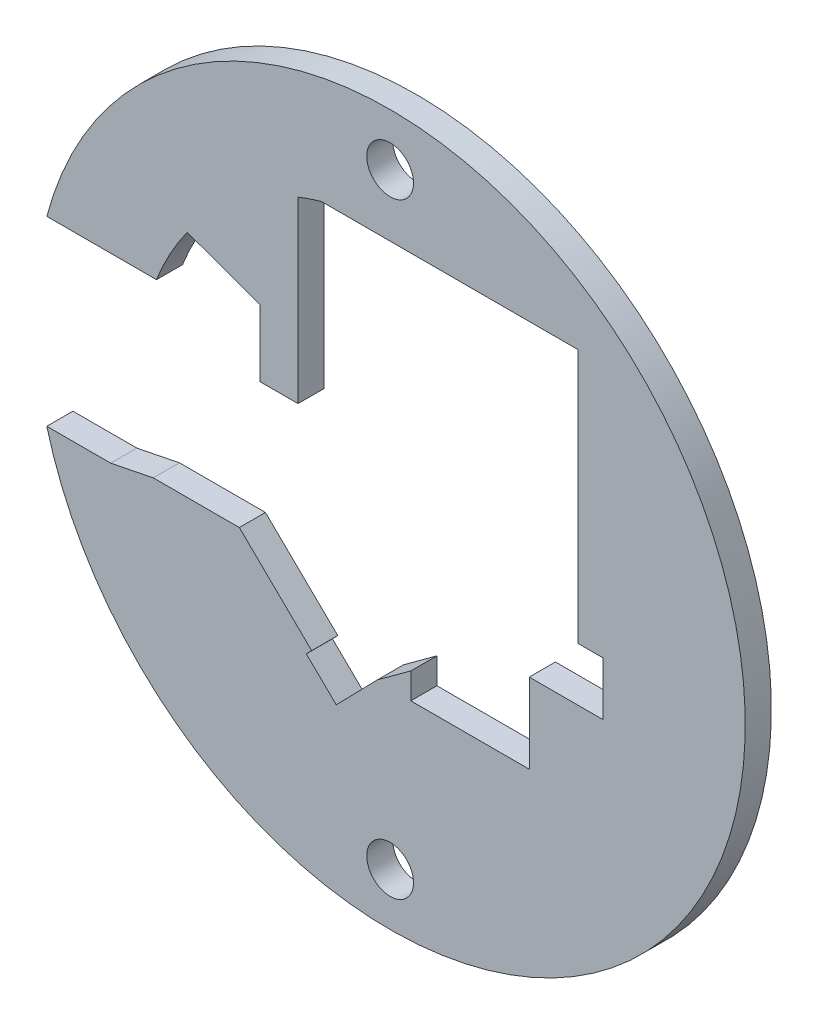
ISO-10303-21;
HEADER;
FILE_DESCRIPTION(('STEP AP214'),'2;1');
FILE_NAME('part.step','',(''),(''),'','','');
FILE_SCHEMA(('AUTOMOTIVE_DESIGN { 1 0 10303 214 1 1 1 1 }'));
ENDSEC;
DATA;
#1=APPLICATION_CONTEXT('core data for automotive mechanical design processes');
#2=APPLICATION_PROTOCOL_DEFINITION('international standard','automotive_design',2000,#1);
#3=PRODUCT_CONTEXT('',#1,'mechanical');
#4=PRODUCT('Part','Part','',(#3));
#5=PRODUCT_RELATED_PRODUCT_CATEGORY('part','',(#4));
#6=PRODUCT_DEFINITION_FORMATION('','',#4);
#7=PRODUCT_DEFINITION_CONTEXT('part definition',#1,'design');
#8=PRODUCT_DEFINITION('design','',#6,#7);
#9=PRODUCT_DEFINITION_SHAPE('','',#8);
#10=(LENGTH_UNIT() NAMED_UNIT(*) SI_UNIT(.MILLI.,.METRE.));
#11=(NAMED_UNIT(*) PLANE_ANGLE_UNIT() SI_UNIT($,.RADIAN.));
#12=(NAMED_UNIT(*) SI_UNIT($,.STERADIAN.) SOLID_ANGLE_UNIT());
#13=UNCERTAINTY_MEASURE_WITH_UNIT(LENGTH_MEASURE(1.E-05),#10,'distance_accuracy_value','');
#14=(GEOMETRIC_REPRESENTATION_CONTEXT(3) GLOBAL_UNCERTAINTY_ASSIGNED_CONTEXT((#13)) GLOBAL_UNIT_ASSIGNED_CONTEXT((#10,
#11,#12)) REPRESENTATION_CONTEXT('',''));
#15=CARTESIAN_POINT('',(0.,0.,0.));
#16=DIRECTION('',(0.,0.,1.));
#17=DIRECTION('',(1.,0.,0.));
#18=AXIS2_PLACEMENT_3D('',#15,#16,#17);
#19=CARTESIAN_POINT('',(0.,0.,1.5875));
#20=DIRECTION('',(0.,0.,-1.));
#21=DIRECTION('',(-1.,0.,0.));
#22=AXIS2_PLACEMENT_3D('',#19,#20,#21);
#23=CYLINDRICAL_SURFACE('',#22,15.24);
#24=CARTESIAN_POINT('',(0.,0.,0.));
#25=DIRECTION('',(0.,0.,1.));
#26=DIRECTION('',(1.,0.,0.));
#27=AXIS2_PLACEMENT_3D('',#24,#25,#26);
#28=CIRCLE('',#27,15.24);
#29=CARTESIAN_POINT('',(-4.17912985680031,14.6558,0.));
#30=VERTEX_POINT('',#29);
#31=CARTESIAN_POINT('',(-5.6007,14.1735584632089,0.));
#32=VERTEX_POINT('',#31);
#33=EDGE_CURVE('E222',#30,#32,#28,.T.);
#34=ORIENTED_EDGE('',*,*,#33,.F.);
#35=DIRECTION('',(0.,0.,-1.));
#36=VECTOR('',#35,1.);
#37=CARTESIAN_POINT('',(-4.17912985680031,14.6558,1.5875));
#38=LINE('',#37,#36);
#39=CARTESIAN_POINT('',(-4.17912985680031,14.6558,1.5875));
#40=VERTEX_POINT('',#39);
#41=EDGE_CURVE('E11',#40,#30,#38,.T.);
#42=ORIENTED_EDGE('',*,*,#41,.F.);
#43=CARTESIAN_POINT('',(0.,0.,1.5875));
#44=DIRECTION('',(0.,0.,1.));
#45=DIRECTION('',(1.,0.,0.));
#46=AXIS2_PLACEMENT_3D('',#43,#44,#45);
#47=CIRCLE('',#46,15.24);
#48=CARTESIAN_POINT('',(-5.6007,14.1735584632089,1.5875));
#49=VERTEX_POINT('',#48);
#50=EDGE_CURVE('E630',#40,#49,#47,.T.);
#51=ORIENTED_EDGE('',*,*,#50,.T.);
#52=DIRECTION('',(0.,0.,-1.));
#53=VECTOR('',#52,1.);
#54=CARTESIAN_POINT('',(-5.6007,14.1735584632089,1.5875));
#55=LINE('',#54,#53);
#56=EDGE_CURVE('E52',#49,#32,#55,.T.);
#57=ORIENTED_EDGE('',*,*,#56,.T.);
#58=EDGE_LOOP('',(#34,#42,#51,#57));
#59=FACE_BOUND('',#58,.T.);
#60=ADVANCED_FACE('F35',(#59),#23,.F.);
#61=CARTESIAN_POINT('',(0.,14.6558,1.5875));
#62=DIRECTION('',(0.,-1.,0.));
#63=DIRECTION('',(0.,0.,-1.));
#64=AXIS2_PLACEMENT_3D('',#61,#62,#63);
#65=PLANE('',#64);
#66=DIRECTION('',(-1.,0.,0.));
#67=VECTOR('',#66,1.);
#68=CARTESIAN_POINT('',(0.,14.6558,0.));
#69=LINE('',#68,#67);
#70=CARTESIAN_POINT('',(11.43,14.6558,0.));
#71=VERTEX_POINT('',#70);
#72=EDGE_CURVE('E225',#71,#30,#69,.T.);
#73=ORIENTED_EDGE('',*,*,#72,.F.);
#74=DIRECTION('',(0.,0.,-1.));
#75=VECTOR('',#74,1.);
#76=CARTESIAN_POINT('',(11.43,14.6558,1.5875));
#77=LINE('',#76,#75);
#78=CARTESIAN_POINT('',(11.43,14.6558,1.5875));
#79=VERTEX_POINT('',#78);
#80=EDGE_CURVE('E44',#79,#71,#77,.T.);
#81=ORIENTED_EDGE('',*,*,#80,.F.);
#82=DIRECTION('',(-1.,0.,0.));
#83=VECTOR('',#82,1.);
#84=CARTESIAN_POINT('',(0.,14.6558,1.5875));
#85=LINE('',#84,#83);
#86=EDGE_CURVE('E348',#79,#40,#85,.T.);
#87=ORIENTED_EDGE('',*,*,#86,.T.);
#88=ORIENTED_EDGE('',*,*,#41,.T.);
#89=EDGE_LOOP('',(#73,#81,#87,#88));
#90=FACE_BOUND('',#89,.T.);
#91=ADVANCED_FACE('F347',(#90),#65,.T.);
#92=CARTESIAN_POINT('',(11.43,0.,1.5875));
#93=DIRECTION('',(1.,0.,0.));
#94=DIRECTION('',(0.,1.,0.));
#95=AXIS2_PLACEMENT_3D('',#92,#93,#94);
#96=PLANE('',#95);
#97=DIRECTION('',(0.,-1.,0.));
#98=VECTOR('',#97,1.);
#99=CARTESIAN_POINT('',(11.43,0.,0.));
#100=LINE('',#99,#98);
#101=CARTESIAN_POINT('',(11.43,-0.812799999999999,0.));
#102=VERTEX_POINT('',#101);
#103=EDGE_CURVE('E228',#71,#102,#100,.T.);
#104=ORIENTED_EDGE('',*,*,#103,.T.);
#105=DIRECTION('',(0.,0.,-1.));
#106=VECTOR('',#105,1.);
#107=CARTESIAN_POINT('',(11.43,-0.812799999999999,1.5875));
#108=LINE('',#107,#106);
#109=CARTESIAN_POINT('',(11.43,-0.812799999999999,1.5875));
#110=VERTEX_POINT('',#109);
#111=EDGE_CURVE('E330',#110,#102,#108,.T.);
#112=ORIENTED_EDGE('',*,*,#111,.F.);
#113=DIRECTION('',(0.,-1.,0.));
#114=VECTOR('',#113,1.);
#115=CARTESIAN_POINT('',(11.43,0.,1.5875));
#116=LINE('',#115,#114);
#117=EDGE_CURVE('E338',#79,#110,#116,.T.);
#118=ORIENTED_EDGE('',*,*,#117,.F.);
#119=ORIENTED_EDGE('',*,*,#80,.T.);
#120=EDGE_LOOP('',(#104,#112,#118,#119));
#121=FACE_BOUND('',#120,.T.);
#122=ADVANCED_FACE('F335',(#121),#96,.F.);
#123=CARTESIAN_POINT('',(0.,-0.812799999999999,1.5875));
#124=DIRECTION('',(0.,1.,0.));
#125=DIRECTION('',(0.,0.,1.));
#126=AXIS2_PLACEMENT_3D('',#123,#124,#125);
#127=PLANE('',#126);
#128=DIRECTION('',(1.,0.,0.));
#129=VECTOR('',#128,1.);
#130=CARTESIAN_POINT('',(0.,-0.812799999999999,0.));
#131=LINE('',#130,#129);
#132=CARTESIAN_POINT('',(12.9413,-0.812799999999999,0.));
#133=VERTEX_POINT('',#132);
#134=EDGE_CURVE('E231',#102,#133,#131,.T.);
#135=ORIENTED_EDGE('',*,*,#134,.T.);
#136=DIRECTION('',(0.,0.,-1.));
#137=VECTOR('',#136,1.);
#138=CARTESIAN_POINT('',(12.9413,-0.812799999999999,1.5875));
#139=LINE('',#138,#137);
#140=CARTESIAN_POINT('',(12.9413,-0.812799999999999,1.5875));
#141=VERTEX_POINT('',#140);
#142=EDGE_CURVE('E327',#141,#133,#139,.T.);
#143=ORIENTED_EDGE('',*,*,#142,.F.);
#144=DIRECTION('',(1.,0.,0.));
#145=VECTOR('',#144,1.);
#146=CARTESIAN_POINT('',(0.,-0.812799999999999,1.5875));
#147=LINE('',#146,#145);
#148=EDGE_CURVE('E634',#110,#141,#147,.T.);
#149=ORIENTED_EDGE('',*,*,#148,.F.);
#150=ORIENTED_EDGE('',*,*,#111,.T.);
#151=EDGE_LOOP('',(#135,#143,#149,#150));
#152=FACE_BOUND('',#151,.T.);
#153=ADVANCED_FACE('F412',(#152),#127,.F.);
#154=CARTESIAN_POINT('',(12.9413,0.,1.5875));
#155=DIRECTION('',(1.,0.,0.));
#156=DIRECTION('',(0.,0.,-1.));
#157=AXIS2_PLACEMENT_3D('',#154,#155,#156);
#158=PLANE('',#157);
#159=DIRECTION('',(0.,-1.,0.));
#160=VECTOR('',#159,1.);
#161=CARTESIAN_POINT('',(12.9413,0.,0.));
#162=LINE('',#161,#160);
#163=CARTESIAN_POINT('',(12.9413,-4.064,0.));
#164=VERTEX_POINT('',#163);
#165=EDGE_CURVE('E234',#133,#164,#162,.T.);
#166=ORIENTED_EDGE('',*,*,#165,.T.);
#167=DIRECTION('',(0.,0.,-1.));
#168=VECTOR('',#167,1.);
#169=CARTESIAN_POINT('',(12.9413,-4.064,1.5875));
#170=LINE('',#169,#168);
#171=CARTESIAN_POINT('',(12.9413,-4.064,1.5875));
#172=VERTEX_POINT('',#171);
#173=EDGE_CURVE('E325',#172,#164,#170,.T.);
#174=ORIENTED_EDGE('',*,*,#173,.F.);
#175=DIRECTION('',(0.,-1.,0.));
#176=VECTOR('',#175,1.);
#177=CARTESIAN_POINT('',(12.9413,0.,1.5875));
#178=LINE('',#177,#176);
#179=EDGE_CURVE('E637',#141,#172,#178,.T.);
#180=ORIENTED_EDGE('',*,*,#179,.F.);
#181=ORIENTED_EDGE('',*,*,#142,.T.);
#182=EDGE_LOOP('',(#166,#174,#180,#181));
#183=FACE_BOUND('',#182,.T.);
#184=ADVANCED_FACE('F408',(#183),#158,.F.);
#185=CARTESIAN_POINT('',(0.,-4.064,1.5875));
#186=DIRECTION('',(0.,1.,0.));
#187=DIRECTION('',(0.,0.,1.));
#188=AXIS2_PLACEMENT_3D('',#185,#186,#187);
#189=PLANE('',#188);
#190=DIRECTION('',(1.,0.,0.));
#191=VECTOR('',#190,1.);
#192=CARTESIAN_POINT('',(0.,-4.064,0.));
#193=LINE('',#192,#191);
#194=CARTESIAN_POINT('',(8.4582,-4.064,0.));
#195=VERTEX_POINT('',#194);
#196=EDGE_CURVE('E237',#195,#164,#193,.T.);
#197=ORIENTED_EDGE('',*,*,#196,.F.);
#198=DIRECTION('',(0.,0.,-1.));
#199=VECTOR('',#198,1.);
#200=CARTESIAN_POINT('',(8.4582,-4.064,1.5875));
#201=LINE('',#200,#199);
#202=CARTESIAN_POINT('',(8.4582,-4.064,1.5875));
#203=VERTEX_POINT('',#202);
#204=EDGE_CURVE('E323',#203,#195,#201,.T.);
#205=ORIENTED_EDGE('',*,*,#204,.F.);
#206=DIRECTION('',(1.,0.,0.));
#207=VECTOR('',#206,1.);
#208=CARTESIAN_POINT('',(0.,-4.064,1.5875));
#209=LINE('',#208,#207);
#210=EDGE_CURVE('E639',#203,#172,#209,.T.);
#211=ORIENTED_EDGE('',*,*,#210,.T.);
#212=ORIENTED_EDGE('',*,*,#173,.T.);
#213=EDGE_LOOP('',(#197,#205,#211,#212));
#214=FACE_BOUND('',#213,.T.);
#215=ADVANCED_FACE('F404',(#214),#189,.T.);
#216=CARTESIAN_POINT('',(8.4582,0.,1.5875));
#217=DIRECTION('',(1.,0.,0.));
#218=DIRECTION('',(0.,0.,-1.));
#219=AXIS2_PLACEMENT_3D('',#216,#217,#218);
#220=PLANE('',#219);
#221=DIRECTION('',(0.,-1.,0.));
#222=VECTOR('',#221,1.);
#223=CARTESIAN_POINT('',(8.4582,0.,0.));
#224=LINE('',#223,#222);
#225=CARTESIAN_POINT('',(8.4582,-8.9154,0.));
#226=VERTEX_POINT('',#225);
#227=EDGE_CURVE('E240',#195,#226,#224,.T.);
#228=ORIENTED_EDGE('',*,*,#227,.T.);
#229=DIRECTION('',(0.,0.,-1.));
#230=VECTOR('',#229,1.);
#231=CARTESIAN_POINT('',(8.4582,-8.9154,1.5875));
#232=LINE('',#231,#230);
#233=CARTESIAN_POINT('',(8.4582,-8.9154,1.5875));
#234=VERTEX_POINT('',#233);
#235=EDGE_CURVE('E321',#234,#226,#232,.T.);
#236=ORIENTED_EDGE('',*,*,#235,.F.);
#237=DIRECTION('',(0.,-1.,0.));
#238=VECTOR('',#237,1.);
#239=CARTESIAN_POINT('',(8.4582,0.,1.5875));
#240=LINE('',#239,#238);
#241=EDGE_CURVE('E642',#203,#234,#240,.T.);
#242=ORIENTED_EDGE('',*,*,#241,.F.);
#243=ORIENTED_EDGE('',*,*,#204,.T.);
#244=EDGE_LOOP('',(#228,#236,#242,#243));
#245=FACE_BOUND('',#244,.T.);
#246=ADVANCED_FACE('F400',(#245),#220,.F.);
#247=CARTESIAN_POINT('',(0.,-8.9154,1.5875));
#248=DIRECTION('',(0.,1.,0.));
#249=DIRECTION('',(0.,0.,1.));
#250=AXIS2_PLACEMENT_3D('',#247,#248,#249);
#251=PLANE('',#250);
#252=DIRECTION('',(1.,0.,0.));
#253=VECTOR('',#252,1.);
#254=CARTESIAN_POINT('',(0.,-8.9154,0.));
#255=LINE('',#254,#253);
#256=CARTESIAN_POINT('',(1.2573,-8.9154,0.));
#257=VERTEX_POINT('',#256);
#258=EDGE_CURVE('E243',#257,#226,#255,.T.);
#259=ORIENTED_EDGE('',*,*,#258,.F.);
#260=DIRECTION('',(0.,0.,-1.));
#261=VECTOR('',#260,1.);
#262=CARTESIAN_POINT('',(1.2573,-8.9154,1.5875));
#263=LINE('',#262,#261);
#264=CARTESIAN_POINT('',(1.2573,-8.9154,1.5875));
#265=VERTEX_POINT('',#264);
#266=EDGE_CURVE('E319',#265,#257,#263,.T.);
#267=ORIENTED_EDGE('',*,*,#266,.F.);
#268=DIRECTION('',(1.,0.,0.));
#269=VECTOR('',#268,1.);
#270=CARTESIAN_POINT('',(0.,-8.9154,1.5875));
#271=LINE('',#270,#269);
#272=EDGE_CURVE('E644',#265,#234,#271,.T.);
#273=ORIENTED_EDGE('',*,*,#272,.T.);
#274=ORIENTED_EDGE('',*,*,#235,.T.);
#275=EDGE_LOOP('',(#259,#267,#273,#274));
#276=FACE_BOUND('',#275,.T.);
#277=ADVANCED_FACE('F396',(#276),#251,.T.);
#278=CARTESIAN_POINT('',(1.2573,0.,1.5875));
#279=DIRECTION('',(1.,0.,0.));
#280=DIRECTION('',(0.,1.,0.));
#281=AXIS2_PLACEMENT_3D('',#278,#279,#280);
#282=PLANE('',#281);
#283=DIRECTION('',(0.,-1.,0.));
#284=VECTOR('',#283,1.);
#285=CARTESIAN_POINT('',(1.2573,0.,0.));
#286=LINE('',#285,#284);
#287=CARTESIAN_POINT('',(1.2573,-7.3406,0.));
#288=VERTEX_POINT('',#287);
#289=EDGE_CURVE('E246',#288,#257,#286,.T.);
#290=ORIENTED_EDGE('',*,*,#289,.F.);
#291=DIRECTION('',(0.,0.,-1.));
#292=VECTOR('',#291,1.);
#293=CARTESIAN_POINT('',(1.2573,-7.3406,1.5875));
#294=LINE('',#293,#292);
#295=CARTESIAN_POINT('',(1.2573,-7.3406,1.5875));
#296=VERTEX_POINT('',#295);
#297=EDGE_CURVE('E317',#296,#288,#294,.T.);
#298=ORIENTED_EDGE('',*,*,#297,.F.);
#299=DIRECTION('',(0.,-1.,0.));
#300=VECTOR('',#299,1.);
#301=CARTESIAN_POINT('',(1.2573,0.,1.5875));
#302=LINE('',#301,#300);
#303=EDGE_CURVE('E647',#296,#265,#302,.T.);
#304=ORIENTED_EDGE('',*,*,#303,.T.);
#305=ORIENTED_EDGE('',*,*,#266,.T.);
#306=EDGE_LOOP('',(#290,#298,#304,#305));
#307=FACE_BOUND('',#306,.T.);
#308=ADVANCED_FACE('F392',(#307),#282,.T.);
#309=CARTESIAN_POINT('',(3.9356362264247,-5.38206663442695,1.5875));
#310=DIRECTION('',(-0.590269542075195,0.807206211384885,0.));
#311=DIRECTION('',(-0.807206211384885,-0.590269542075195,0.));
#312=AXIS2_PLACEMENT_3D('',#309,#310,#311);
#313=PLANE('',#312);
#314=DIRECTION('',(0.807206211384885,0.590269542075195,0.));
#315=VECTOR('',#314,1.);
#316=CARTESIAN_POINT('',(3.9356362264247,-5.38206663442695,0.));
#317=LINE('',#316,#315);
#318=CARTESIAN_POINT('',(-0.774699999999994,-8.82649999999999,0.));
#319=VERTEX_POINT('',#318);
#320=EDGE_CURVE('E249',#319,#288,#317,.T.);
#321=ORIENTED_EDGE('',*,*,#320,.F.);
#322=DIRECTION('',(0.,0.,-1.));
#323=VECTOR('',#322,1.);
#324=CARTESIAN_POINT('',(-0.774699999999994,-8.82649999999999,1.5875));
#325=LINE('',#324,#323);
#326=CARTESIAN_POINT('',(-0.774699999999994,-8.82649999999999,1.5875));
#327=VERTEX_POINT('',#326);
#328=EDGE_CURVE('E315',#327,#319,#325,.T.);
#329=ORIENTED_EDGE('',*,*,#328,.F.);
#330=DIRECTION('',(0.807206211384885,0.590269542075195,0.));
#331=VECTOR('',#330,1.);
#332=CARTESIAN_POINT('',(3.9356362264247,-5.38206663442695,1.5875));
#333=LINE('',#332,#331);
#334=EDGE_CURVE('E650',#327,#296,#333,.T.);
#335=ORIENTED_EDGE('',*,*,#334,.T.);
#336=ORIENTED_EDGE('',*,*,#297,.T.);
#337=EDGE_LOOP('',(#321,#329,#335,#336));
#338=FACE_BOUND('',#337,.T.);
#339=ADVANCED_FACE('F388',(#338),#313,.T.);
#340=CARTESIAN_POINT('',(4.01423347372456,-3.91037972961723,1.5875));
#341=DIRECTION('',(0.71631205673759,-0.697780078085039,0.));
#342=DIRECTION('',(0.697780078085039,0.71631205673759,0.));
#343=AXIS2_PLACEMENT_3D('',#340,#341,#342);
#344=PLANE('',#343);
#345=DIRECTION('',(-0.697780078085039,-0.71631205673759,0.));
#346=VECTOR('',#345,1.);
#347=CARTESIAN_POINT('',(4.01423347372456,-3.91037972961723,0.));
#348=LINE('',#347,#346);
#349=CARTESIAN_POINT('',(-3.27372957165375,-11.3919,0.));
#350=VERTEX_POINT('',#349);
#351=EDGE_CURVE('E252',#319,#350,#348,.T.);
#352=ORIENTED_EDGE('',*,*,#351,.T.);
#353=DIRECTION('',(0.,0.,-1.));
#354=VECTOR('',#353,1.);
#355=CARTESIAN_POINT('',(-3.27372957165375,-11.3919,1.5875));
#356=LINE('',#355,#354);
#357=CARTESIAN_POINT('',(-3.27372957165375,-11.3919,1.5875));
#358=VERTEX_POINT('',#357);
#359=EDGE_CURVE('E313',#358,#350,#356,.T.);
#360=ORIENTED_EDGE('',*,*,#359,.F.);
#361=DIRECTION('',(-0.697780078085039,-0.71631205673759,0.));
#362=VECTOR('',#361,1.);
#363=CARTESIAN_POINT('',(4.01423347372456,-3.91037972961723,1.5875));
#364=LINE('',#363,#362);
#365=EDGE_CURVE('E653',#327,#358,#364,.T.);
#366=ORIENTED_EDGE('',*,*,#365,.F.);
#367=ORIENTED_EDGE('',*,*,#328,.T.);
#368=EDGE_LOOP('',(#352,#360,#366,#367));
#369=FACE_BOUND('',#368,.T.);
#370=ADVANCED_FACE('F384',(#369),#344,.F.);
#371=CARTESIAN_POINT('',(-7.28796304537831,-7.48152027038277,1.5875));
#372=DIRECTION('',(0.697780078085039,0.71631205673759,0.));
#373=DIRECTION('',(-0.71631205673759,0.697780078085039,0.));
#374=AXIS2_PLACEMENT_3D('',#371,#372,#373);
#375=PLANE('',#374);
#376=DIRECTION('',(0.71631205673759,-0.697780078085039,0.));
#377=VECTOR('',#376,1.);
#378=CARTESIAN_POINT('',(-7.28796304537831,-7.48152027038277,0.));
#379=LINE('',#378,#377);
#380=CARTESIAN_POINT('',(-5.09316219576723,-9.619538601664,0.));
#381=VERTEX_POINT('',#380);
#382=EDGE_CURVE('E255',#381,#350,#379,.T.);
#383=ORIENTED_EDGE('',*,*,#382,.F.);
#384=DIRECTION('',(0.,0.,-1.));
#385=VECTOR('',#384,1.);
#386=CARTESIAN_POINT('',(-5.09316219576723,-9.619538601664,1.5875));
#387=LINE('',#386,#385);
#388=CARTESIAN_POINT('',(-5.09316219576723,-9.619538601664,1.5875));
#389=VERTEX_POINT('',#388);
#390=EDGE_CURVE('E311',#389,#381,#387,.T.);
#391=ORIENTED_EDGE('',*,*,#390,.F.);
#392=DIRECTION('',(0.71631205673759,-0.697780078085039,0.));
#393=VECTOR('',#392,1.);
#394=CARTESIAN_POINT('',(-7.28796304537831,-7.48152027038277,1.5875));
#395=LINE('',#394,#393);
#396=EDGE_CURVE('E655',#389,#358,#395,.T.);
#397=ORIENTED_EDGE('',*,*,#396,.T.);
#398=ORIENTED_EDGE('',*,*,#359,.T.);
#399=EDGE_LOOP('',(#383,#391,#397,#398));
#400=FACE_BOUND('',#399,.T.);
#401=ADVANCED_FACE('F380',(#400),#375,.T.);
#402=CARTESIAN_POINT('',(2.19480084961102,-2.13801833128113,1.5875));
#403=DIRECTION('',(0.716312056737598,-0.697780078085031,0.));
#404=DIRECTION('',(0.697780078085031,0.716312056737598,0.));
#405=AXIS2_PLACEMENT_3D('',#402,#403,#404);
#406=PLANE('',#405);
#407=DIRECTION('',(-0.697780078085031,-0.716312056737598,0.));
#408=VECTOR('',#407,1.);
#409=CARTESIAN_POINT('',(2.19480084961102,-2.13801833128113,0.));
#410=LINE('',#409,#408);
#411=CARTESIAN_POINT('',(-4.76970624057092,-9.28749214776329,0.));
#412=VERTEX_POINT('',#411);
#413=EDGE_CURVE('E258',#412,#381,#410,.T.);
#414=ORIENTED_EDGE('',*,*,#413,.F.);
#415=DIRECTION('',(0.,0.,-1.));
#416=VECTOR('',#415,1.);
#417=CARTESIAN_POINT('',(-4.76970624057092,-9.28749214776329,1.5875));
#418=LINE('',#417,#416);
#419=CARTESIAN_POINT('',(-4.76970624057092,-9.28749214776329,1.5875));
#420=VERTEX_POINT('',#419);
#421=EDGE_CURVE('E309',#420,#412,#418,.T.);
#422=ORIENTED_EDGE('',*,*,#421,.F.);
#423=DIRECTION('',(-0.697780078085031,-0.716312056737598,0.));
#424=VECTOR('',#423,1.);
#425=CARTESIAN_POINT('',(2.19480084961102,-2.13801833128113,1.5875));
#426=LINE('',#425,#424);
#427=EDGE_CURVE('E607',#420,#389,#426,.T.);
#428=ORIENTED_EDGE('',*,*,#427,.T.);
#429=ORIENTED_EDGE('',*,*,#390,.T.);
#430=EDGE_LOOP('',(#414,#422,#428,#429));
#431=FACE_BOUND('',#430,.T.);
#432=ADVANCED_FACE('F376',(#431),#406,.T.);
#433=CARTESIAN_POINT('',(-6.96450709018199,-7.14947381648206,1.5875));
#434=DIRECTION('',(0.697780078085039,0.71631205673759,0.));
#435=DIRECTION('',(-0.71631205673759,0.697780078085039,0.));
#436=AXIS2_PLACEMENT_3D('',#433,#434,#435);
#437=PLANE('',#436);
#438=DIRECTION('',(0.71631205673759,-0.697780078085039,0.));
#439=VECTOR('',#438,1.);
#440=CARTESIAN_POINT('',(-6.96450709018199,-7.14947381648206,0.));
#441=LINE('',#440,#439);
#442=CARTESIAN_POINT('',(-9.16716674304894,-5.0038,0.));
#443=VERTEX_POINT('',#442);
#444=EDGE_CURVE('E261',#443,#412,#441,.T.);
#445=ORIENTED_EDGE('',*,*,#444,.F.);
#446=DIRECTION('',(0.,0.,-1.));
#447=VECTOR('',#446,1.);
#448=CARTESIAN_POINT('',(-9.16716674304894,-5.0038,1.5875));
#449=LINE('',#448,#447);
#450=CARTESIAN_POINT('',(-9.16716674304894,-5.0038,1.5875));
#451=VERTEX_POINT('',#450);
#452=EDGE_CURVE('E307',#451,#443,#449,.T.);
#453=ORIENTED_EDGE('',*,*,#452,.F.);
#454=DIRECTION('',(0.71631205673759,-0.697780078085039,0.));
#455=VECTOR('',#454,1.);
#456=CARTESIAN_POINT('',(-6.96450709018199,-7.14947381648206,1.5875));
#457=LINE('',#456,#455);
#458=EDGE_CURVE('E602',#451,#420,#457,.T.);
#459=ORIENTED_EDGE('',*,*,#458,.T.);
#460=ORIENTED_EDGE('',*,*,#421,.T.);
#461=EDGE_LOOP('',(#445,#453,#459,#460));
#462=FACE_BOUND('',#461,.T.);
#463=ADVANCED_FACE('F372',(#462),#437,.T.);
#464=CARTESIAN_POINT('',(0.,-5.0038,1.5875));
#465=DIRECTION('',(0.,1.,0.));
#466=DIRECTION('',(0.,0.,1.));
#467=AXIS2_PLACEMENT_3D('',#464,#465,#466);
#468=PLANE('',#467);
#469=DIRECTION('',(1.,0.,0.));
#470=VECTOR('',#469,1.);
#471=CARTESIAN_POINT('',(0.,-5.0038,0.));
#472=LINE('',#471,#470);
#473=CARTESIAN_POINT('',(-14.3951236729665,-5.0038,0.));
#474=VERTEX_POINT('',#473);
#475=EDGE_CURVE('E264',#474,#443,#472,.T.);
#476=ORIENTED_EDGE('',*,*,#475,.F.);
#477=DIRECTION('',(0.,0.,-1.));
#478=VECTOR('',#477,1.);
#479=CARTESIAN_POINT('',(-14.3951236729665,-5.0038,1.5875));
#480=LINE('',#479,#478);
#481=CARTESIAN_POINT('',(-14.3951236729665,-5.0038,1.5875));
#482=VERTEX_POINT('',#481);
#483=EDGE_CURVE('E305',#482,#474,#480,.T.);
#484=ORIENTED_EDGE('',*,*,#483,.F.);
#485=DIRECTION('',(1.,0.,0.));
#486=VECTOR('',#485,1.);
#487=CARTESIAN_POINT('',(0.,-5.0038,1.5875));
#488=LINE('',#487,#486);
#489=EDGE_CURVE('E598',#482,#451,#488,.T.);
#490=ORIENTED_EDGE('',*,*,#489,.T.);
#491=ORIENTED_EDGE('',*,*,#452,.T.);
#492=EDGE_LOOP('',(#476,#484,#490,#491));
#493=FACE_BOUND('',#492,.T.);
#494=ADVANCED_FACE('F369',(#493),#468,.T.);
#495=CARTESIAN_POINT('',(0.,-5.5245,1.5875));
#496=DIRECTION('',(0.,-1.,0.));
#497=DIRECTION('',(1.,0.,0.));
#498=AXIS2_PLACEMENT_3D('',#495,#496,#497);
#499=PLANE('',#498);
#500=DIRECTION('',(-1.,0.,0.));
#501=VECTOR('',#500,1.);
#502=CARTESIAN_POINT('',(0.,-5.5245,0.));
#503=LINE('',#502,#501);
#504=CARTESIAN_POINT('',(-16.9840587441892,-5.5245,0.));
#505=VERTEX_POINT('',#504);
#506=CARTESIAN_POINT('',(-20.8712242034338,-5.5245,0.));
#507=VERTEX_POINT('',#506);
#508=EDGE_CURVE('E267',#505,#507,#503,.T.);
#509=ORIENTED_EDGE('',*,*,#508,.T.);
#510=DIRECTION('',(0.,0.,-1.));
#511=VECTOR('',#510,1.);
#512=CARTESIAN_POINT('',(-20.8712242034338,-5.5245,1.5875));
#513=LINE('',#512,#511);
#514=CARTESIAN_POINT('',(-20.8712242034338,-5.5245,1.5875));
#515=VERTEX_POINT('',#514);
#516=EDGE_CURVE('E299',#515,#507,#513,.T.);
#517=ORIENTED_EDGE('',*,*,#516,.F.);
#518=DIRECTION('',(-1.,0.,0.));
#519=VECTOR('',#518,1.);
#520=CARTESIAN_POINT('',(0.,-5.5245,1.5875));
#521=LINE('',#520,#519);
#522=CARTESIAN_POINT('',(-16.9840587441892,-5.5245,1.5875));
#523=VERTEX_POINT('',#522);
#524=EDGE_CURVE('E603',#523,#515,#521,.T.);
#525=ORIENTED_EDGE('',*,*,#524,.F.);
#526=DIRECTION('',(0.,0.,-1.));
#527=VECTOR('',#526,1.);
#528=CARTESIAN_POINT('',(-16.9840587441892,-5.5245,1.5875));
#529=LINE('',#528,#527);
#530=EDGE_CURVE('E302',#523,#505,#529,.T.);
#531=ORIENTED_EDGE('',*,*,#530,.T.);
#532=EDGE_LOOP('',(#509,#517,#525,#531));
#533=FACE_BOUND('',#532,.T.);
#534=ADVANCED_FACE('F367',(#533),#499,.F.);
#535=CARTESIAN_POINT('',(0.,0.,1.5875));
#536=DIRECTION('',(0.,0.,-1.));
#537=DIRECTION('',(-1.,0.,0.));
#538=AXIS2_PLACEMENT_3D('',#535,#536,#537);
#539=CYLINDRICAL_SURFACE('',#538,21.59);
#540=CARTESIAN_POINT('',(0.,0.,0.));
#541=DIRECTION('',(0.,0.,1.));
#542=DIRECTION('',(1.,0.,0.));
#543=AXIS2_PLACEMENT_3D('',#540,#541,#542);
#544=CIRCLE('',#543,21.59);
#545=CARTESIAN_POINT('',(-20.8712242034338,5.5245,0.));
#546=VERTEX_POINT('',#545);
#547=EDGE_CURVE('E270',#507,#546,#544,.T.);
#548=ORIENTED_EDGE('',*,*,#547,.T.);
#549=DIRECTION('',(0.,0.,-1.));
#550=VECTOR('',#549,1.);
#551=CARTESIAN_POINT('',(-20.8712242034338,5.5245,1.5875));
#552=LINE('',#551,#550);
#553=CARTESIAN_POINT('',(-20.8712242034338,5.5245,1.5875));
#554=VERTEX_POINT('',#553);
#555=EDGE_CURVE('E297',#554,#546,#552,.T.);
#556=ORIENTED_EDGE('',*,*,#555,.F.);
#557=CARTESIAN_POINT('',(0.,0.,1.5875));
#558=DIRECTION('',(0.,0.,1.));
#559=DIRECTION('',(1.,0.,0.));
#560=AXIS2_PLACEMENT_3D('',#557,#558,#559);
#561=CIRCLE('',#560,21.59);
#562=EDGE_CURVE('E605',#515,#554,#561,.T.);
#563=ORIENTED_EDGE('',*,*,#562,.F.);
#564=ORIENTED_EDGE('',*,*,#516,.T.);
#565=EDGE_LOOP('',(#548,#556,#563,#564));
#566=FACE_BOUND('',#565,.T.);
#567=ADVANCED_FACE('F481',(#566),#539,.T.);
#568=CARTESIAN_POINT('',(0.,5.5245,1.5875));
#569=DIRECTION('',(0.,-1.,0.));
#570=DIRECTION('',(0.,0.,-1.));
#571=AXIS2_PLACEMENT_3D('',#568,#569,#570);
#572=PLANE('',#571);
#573=DIRECTION('',(-1.,0.,0.));
#574=VECTOR('',#573,1.);
#575=CARTESIAN_POINT('',(0.,5.5245,0.));
#576=LINE('',#575,#574);
#577=CARTESIAN_POINT('',(-14.2034326748853,5.5245,0.));
#578=VERTEX_POINT('',#577);
#579=EDGE_CURVE('E273',#578,#546,#576,.T.);
#580=ORIENTED_EDGE('',*,*,#579,.F.);
#581=DIRECTION('',(0.,0.,1.));
#582=VECTOR('',#581,1.);
#583=CARTESIAN_POINT('',(-14.2034326748853,5.5245,0.));
#584=LINE('',#583,#582);
#585=CARTESIAN_POINT('',(-14.2034326748853,5.5245,1.5875));
#586=VERTEX_POINT('',#585);
#587=EDGE_CURVE('E223',#578,#586,#584,.T.);
#588=ORIENTED_EDGE('',*,*,#587,.T.);
#589=DIRECTION('',(-1.,0.,0.));
#590=VECTOR('',#589,1.);
#591=CARTESIAN_POINT('',(0.,5.5245,1.5875));
#592=LINE('',#591,#590);
#593=EDGE_CURVE('E612',#586,#554,#592,.T.);
#594=ORIENTED_EDGE('',*,*,#593,.T.);
#595=ORIENTED_EDGE('',*,*,#555,.T.);
#596=EDGE_LOOP('',(#580,#588,#594,#595));
#597=FACE_BOUND('',#596,.T.);
#598=ADVANCED_FACE('F490',(#597),#572,.T.);
#599=CARTESIAN_POINT('',(0.,0.,1.5875));
#600=DIRECTION('',(0.,0.,-1.));
#601=DIRECTION('',(-1.,0.,0.));
#602=AXIS2_PLACEMENT_3D('',#599,#600,#601);
#603=CYLINDRICAL_SURFACE('',#602,15.24);
#604=ORIENTED_EDGE('',*,*,#587,.F.);
#605=CARTESIAN_POINT('',(0.,0.,0.));
#606=DIRECTION('',(0.,0.,1.));
#607=DIRECTION('',(1.,0.,0.));
#608=AXIS2_PLACEMENT_3D('',#605,#606,#607);
#609=CIRCLE('',#608,15.24);
#610=CARTESIAN_POINT('',(-12.3325762819453,8.9535,0.));
#611=VERTEX_POINT('',#610);
#612=EDGE_CURVE('E276',#611,#578,#609,.T.);
#613=ORIENTED_EDGE('',*,*,#612,.F.);
#614=DIRECTION('',(0.,0.,-1.));
#615=VECTOR('',#614,1.);
#616=CARTESIAN_POINT('',(-12.3325762819453,8.9535,1.5875));
#617=LINE('',#616,#615);
#618=CARTESIAN_POINT('',(-12.3325762819453,8.9535,1.5875));
#619=VERTEX_POINT('',#618);
#620=EDGE_CURVE('E295',#619,#611,#617,.T.);
#621=ORIENTED_EDGE('',*,*,#620,.F.);
#622=CARTESIAN_POINT('',(0.,0.,1.5875));
#623=DIRECTION('',(0.,0.,1.));
#624=DIRECTION('',(1.,0.,0.));
#625=AXIS2_PLACEMENT_3D('',#622,#623,#624);
#626=CIRCLE('',#625,15.24);
#627=EDGE_CURVE('E615',#619,#586,#626,.T.);
#628=ORIENTED_EDGE('',*,*,#627,.T.);
#629=EDGE_LOOP('',(#604,#613,#621,#628));
#630=FACE_BOUND('',#629,.T.);
#631=ADVANCED_FACE('F494',(#630),#603,.F.);
#632=CARTESIAN_POINT('',(1.43838963998687,3.99376361532598,1.5875));
#633=DIRECTION('',(0.338851839147555,0.94083974783505,0.));
#634=DIRECTION('',(-0.94083974783505,0.338851839147555,0.));
#635=AXIS2_PLACEMENT_3D('',#632,#633,#634);
#636=PLANE('',#635);
#637=DIRECTION('',(0.94083974783505,-0.338851839147555,0.));
#638=VECTOR('',#637,1.);
#639=CARTESIAN_POINT('',(1.43838963998687,3.99376361532598,0.));
#640=LINE('',#639,#638);
#641=CARTESIAN_POINT('',(-7.9248,7.366,0.));
#642=VERTEX_POINT('',#641);
#643=EDGE_CURVE('E279',#611,#642,#640,.T.);
#644=ORIENTED_EDGE('',*,*,#643,.T.);
#645=DIRECTION('',(0.,0.,-1.));
#646=VECTOR('',#645,1.);
#647=CARTESIAN_POINT('',(-7.9248,7.366,1.5875));
#648=LINE('',#647,#646);
#649=CARTESIAN_POINT('',(-7.9248,7.366,1.5875));
#650=VERTEX_POINT('',#649);
#651=EDGE_CURVE('E196',#650,#642,#648,.T.);
#652=ORIENTED_EDGE('',*,*,#651,.F.);
#653=DIRECTION('',(0.94083974783505,-0.338851839147555,0.));
#654=VECTOR('',#653,1.);
#655=CARTESIAN_POINT('',(1.43838963998687,3.99376361532598,1.5875));
#656=LINE('',#655,#654);
#657=EDGE_CURVE('E207',#619,#650,#656,.T.);
#658=ORIENTED_EDGE('',*,*,#657,.F.);
#659=ORIENTED_EDGE('',*,*,#620,.T.);
#660=EDGE_LOOP('',(#644,#652,#658,#659));
#661=FACE_BOUND('',#660,.T.);
#662=ADVANCED_FACE('F499',(#661),#636,.F.);
#663=CARTESIAN_POINT('',(-7.9248,0.,1.5875));
#664=DIRECTION('',(-1.,0.,0.));
#665=DIRECTION('',(0.,0.,1.));
#666=AXIS2_PLACEMENT_3D('',#663,#664,#665);
#667=PLANE('',#666);
#668=DIRECTION('',(0.,1.,0.));
#669=VECTOR('',#668,1.);
#670=CARTESIAN_POINT('',(-7.9248,0.,0.));
#671=LINE('',#670,#669);
#672=CARTESIAN_POINT('',(-7.9248,3.302,0.));
#673=VERTEX_POINT('',#672);
#674=EDGE_CURVE('E192',#673,#642,#671,.T.);
#675=ORIENTED_EDGE('',*,*,#674,.F.);
#676=DIRECTION('',(0.,0.,-1.));
#677=VECTOR('',#676,1.);
#678=CARTESIAN_POINT('',(-7.9248,3.302,1.5875));
#679=LINE('',#678,#677);
#680=CARTESIAN_POINT('',(-7.9248,3.302,1.5875));
#681=VERTEX_POINT('',#680);
#682=EDGE_CURVE('E187',#681,#673,#679,.T.);
#683=ORIENTED_EDGE('',*,*,#682,.F.);
#684=DIRECTION('',(0.,1.,0.));
#685=VECTOR('',#684,1.);
#686=CARTESIAN_POINT('',(-7.9248,0.,1.5875));
#687=LINE('',#686,#685);
#688=EDGE_CURVE('E190',#681,#650,#687,.T.);
#689=ORIENTED_EDGE('',*,*,#688,.T.);
#690=ORIENTED_EDGE('',*,*,#651,.T.);
#691=EDGE_LOOP('',(#675,#683,#689,#690));
#692=FACE_BOUND('',#691,.T.);
#693=ADVANCED_FACE('F189',(#692),#667,.T.);
#694=CARTESIAN_POINT('',(0.,3.302,1.5875));
#695=DIRECTION('',(0.,-1.,0.));
#696=DIRECTION('',(1.,0.,0.));
#697=AXIS2_PLACEMENT_3D('',#694,#695,#696);
#698=PLANE('',#697);
#699=DIRECTION('',(-1.,0.,0.));
#700=VECTOR('',#699,1.);
#701=CARTESIAN_POINT('',(0.,3.302,0.));
#702=LINE('',#701,#700);
#703=CARTESIAN_POINT('',(-5.6007,3.302,0.));
#704=VERTEX_POINT('',#703);
#705=EDGE_CURVE('E283',#704,#673,#702,.T.);
#706=ORIENTED_EDGE('',*,*,#705,.F.);
#707=DIRECTION('',(0.,0.,-1.));
#708=VECTOR('',#707,1.);
#709=CARTESIAN_POINT('',(-5.6007,3.302,1.5875));
#710=LINE('',#709,#708);
#711=CARTESIAN_POINT('',(-5.6007,3.302,1.5875));
#712=VERTEX_POINT('',#711);
#713=EDGE_CURVE('E120',#712,#704,#710,.T.);
#714=ORIENTED_EDGE('',*,*,#713,.F.);
#715=DIRECTION('',(-1.,0.,0.));
#716=VECTOR('',#715,1.);
#717=CARTESIAN_POINT('',(0.,3.302,1.5875));
#718=LINE('',#717,#716);
#719=EDGE_CURVE('E204',#712,#681,#718,.T.);
#720=ORIENTED_EDGE('',*,*,#719,.T.);
#721=ORIENTED_EDGE('',*,*,#682,.T.);
#722=EDGE_LOOP('',(#706,#714,#720,#721));
#723=FACE_BOUND('',#722,.T.);
#724=ADVANCED_FACE('F210',(#723),#698,.T.);
#725=CARTESIAN_POINT('',(-5.6007,0.,1.5875));
#726=DIRECTION('',(1.,0.,0.));
#727=DIRECTION('',(0.,1.,0.));
#728=AXIS2_PLACEMENT_3D('',#725,#726,#727);
#729=PLANE('',#728);
#730=DIRECTION('',(0.,-1.,0.));
#731=VECTOR('',#730,1.);
#732=CARTESIAN_POINT('',(-5.6007,0.,0.));
#733=LINE('',#732,#731);
#734=EDGE_CURVE('E285',#32,#704,#733,.T.);
#735=ORIENTED_EDGE('',*,*,#734,.F.);
#736=ORIENTED_EDGE('',*,*,#56,.F.);
#737=DIRECTION('',(0.,-1.,0.));
#738=VECTOR('',#737,1.);
#739=CARTESIAN_POINT('',(-5.6007,0.,1.5875));
#740=LINE('',#739,#738);
#741=EDGE_CURVE('E211',#49,#712,#740,.T.);
#742=ORIENTED_EDGE('',*,*,#741,.T.);
#743=ORIENTED_EDGE('',*,*,#713,.T.);
#744=EDGE_LOOP('',(#735,#736,#742,#743));
#745=FACE_BOUND('',#744,.T.);
#746=ADVANCED_FACE('F349',(#745),#729,.T.);
#747=CARTESIAN_POINT('',(0.,18.415,1.5875));
#748=DIRECTION('',(0.,0.,-1.));
#749=DIRECTION('',(-1.,0.,0.));
#750=AXIS2_PLACEMENT_3D('',#747,#748,#749);
#751=CYLINDRICAL_SURFACE('',#750,1.4224);
#752=CARTESIAN_POINT('',(0.,18.415,1.5875));
#753=DIRECTION('',(0.,0.,1.));
#754=DIRECTION('',(1.,0.,0.));
#755=AXIS2_PLACEMENT_3D('',#752,#753,#754);
#756=CIRCLE('',#755,1.4224);
#757=CARTESIAN_POINT('',(1.42240000000001,18.415,1.5875));
#758=VERTEX_POINT('',#757);
#759=EDGE_CURVE('E291',#758,#758,#756,.T.);
#760=ORIENTED_EDGE('',*,*,#759,.T.);
#761=EDGE_LOOP('',(#760));
#762=FACE_BOUND('',#761,.T.);
#763=CARTESIAN_POINT('',(0.,18.415,0.));
#764=DIRECTION('',(0.,0.,1.));
#765=DIRECTION('',(1.,0.,0.));
#766=AXIS2_PLACEMENT_3D('',#763,#764,#765);
#767=CIRCLE('',#766,1.4224);
#768=CARTESIAN_POINT('',(1.42240000000001,18.415,0.));
#769=VERTEX_POINT('',#768);
#770=EDGE_CURVE('E219',#769,#769,#767,.T.);
#771=ORIENTED_EDGE('',*,*,#770,.F.);
#772=EDGE_LOOP('',(#771));
#773=FACE_BOUND('',#772,.T.);
#774=ADVANCED_FACE('F37',(#762,#773),#751,.F.);
#775=CARTESIAN_POINT('',(0.,-18.415,1.5875));
#776=DIRECTION('',(0.,0.,-1.));
#777=DIRECTION('',(-1.,0.,0.));
#778=AXIS2_PLACEMENT_3D('',#775,#776,#777);
#779=CYLINDRICAL_SURFACE('',#778,1.4224);
#780=CARTESIAN_POINT('',(0.,-18.415,1.5875));
#781=DIRECTION('',(0.,0.,1.));
#782=DIRECTION('',(1.,0.,0.));
#783=AXIS2_PLACEMENT_3D('',#780,#781,#782);
#784=CIRCLE('',#783,1.4224);
#785=CARTESIAN_POINT('',(1.42240000000001,-18.415,1.5875));
#786=VERTEX_POINT('',#785);
#787=EDGE_CURVE('E213',#786,#786,#784,.T.);
#788=ORIENTED_EDGE('',*,*,#787,.T.);
#789=EDGE_LOOP('',(#788));
#790=FACE_BOUND('',#789,.T.);
#791=CARTESIAN_POINT('',(0.,-18.415,0.));
#792=DIRECTION('',(0.,0.,1.));
#793=DIRECTION('',(1.,0.,0.));
#794=AXIS2_PLACEMENT_3D('',#791,#792,#793);
#795=CIRCLE('',#794,1.4224);
#796=CARTESIAN_POINT('',(1.42240000000001,-18.415,0.));
#797=VERTEX_POINT('',#796);
#798=EDGE_CURVE('E288',#797,#797,#795,.T.);
#799=ORIENTED_EDGE('',*,*,#798,.F.);
#800=EDGE_LOOP('',(#799));
#801=FACE_BOUND('',#800,.T.);
#802=ADVANCED_FACE('F356',(#790,#801),#779,.F.);
#803=CARTESIAN_POINT('',(0.,0.,1.5875));
#804=DIRECTION('',(0.,0.,1.));
#805=DIRECTION('',(1.,0.,0.));
#806=AXIS2_PLACEMENT_3D('',#803,#804,#805);
#807=PLANE('',#806);
#808=DIRECTION('',(0.980367971629362,0.197176672563797,0.));
#809=VECTOR('',#808,1.);
#810=CARTESIAN_POINT('',(-14.3951236729665,-5.0038,1.5875));
#811=LINE('',#810,#809);
#812=EDGE_CURVE('E585',#523,#482,#811,.T.);
#813=ORIENTED_EDGE('',*,*,#812,.F.);
#814=ORIENTED_EDGE('',*,*,#524,.T.);
#815=ORIENTED_EDGE('',*,*,#562,.T.);
#816=ORIENTED_EDGE('',*,*,#593,.F.);
#817=ORIENTED_EDGE('',*,*,#627,.F.);
#818=ORIENTED_EDGE('',*,*,#657,.T.);
#819=ORIENTED_EDGE('',*,*,#688,.F.);
#820=ORIENTED_EDGE('',*,*,#719,.F.);
#821=ORIENTED_EDGE('',*,*,#741,.F.);
#822=ORIENTED_EDGE('',*,*,#50,.F.);
#823=ORIENTED_EDGE('',*,*,#86,.F.);
#824=ORIENTED_EDGE('',*,*,#117,.T.);
#825=ORIENTED_EDGE('',*,*,#148,.T.);
#826=ORIENTED_EDGE('',*,*,#179,.T.);
#827=ORIENTED_EDGE('',*,*,#210,.F.);
#828=ORIENTED_EDGE('',*,*,#241,.T.);
#829=ORIENTED_EDGE('',*,*,#272,.F.);
#830=ORIENTED_EDGE('',*,*,#303,.F.);
#831=ORIENTED_EDGE('',*,*,#334,.F.);
#832=ORIENTED_EDGE('',*,*,#365,.T.);
#833=ORIENTED_EDGE('',*,*,#396,.F.);
#834=ORIENTED_EDGE('',*,*,#427,.F.);
#835=ORIENTED_EDGE('',*,*,#458,.F.);
#836=ORIENTED_EDGE('',*,*,#489,.F.);
#837=EDGE_LOOP('',(#813,#814,#815,#816,#817,#818,#819,#820,#821,#822,#823,#824,#825,#826,#827,
#828,#829,#830,#831,#832,#833,#834,#835,#836));
#838=FACE_BOUND('',#837,.T.);
#839=ORIENTED_EDGE('',*,*,#759,.F.);
#840=EDGE_LOOP('',(#839));
#841=FACE_BOUND('',#840,.T.);
#842=ORIENTED_EDGE('',*,*,#787,.F.);
#843=EDGE_LOOP('',(#842));
#844=FACE_BOUND('',#843,.T.);
#845=ADVANCED_FACE('F201',(#838,#841,#844),#807,.T.);
#846=CARTESIAN_POINT('',(0.,0.,0.));
#847=DIRECTION('',(0.,0.,1.));
#848=DIRECTION('',(1.,0.,0.));
#849=AXIS2_PLACEMENT_3D('',#846,#847,#848);
#850=PLANE('',#849);
#851=ORIENTED_EDGE('',*,*,#770,.T.);
#852=EDGE_LOOP('',(#851));
#853=FACE_BOUND('',#852,.T.);
#854=ORIENTED_EDGE('',*,*,#508,.F.);
#855=DIRECTION('',(0.980367971629362,0.197176672563797,0.));
#856=VECTOR('',#855,1.);
#857=CARTESIAN_POINT('',(-14.3951236729665,-5.0038,0.));
#858=LINE('',#857,#856);
#859=EDGE_CURVE('E594',#505,#474,#858,.T.);
#860=ORIENTED_EDGE('',*,*,#859,.T.);
#861=ORIENTED_EDGE('',*,*,#475,.T.);
#862=ORIENTED_EDGE('',*,*,#444,.T.);
#863=ORIENTED_EDGE('',*,*,#413,.T.);
#864=ORIENTED_EDGE('',*,*,#382,.T.);
#865=ORIENTED_EDGE('',*,*,#351,.F.);
#866=ORIENTED_EDGE('',*,*,#320,.T.);
#867=ORIENTED_EDGE('',*,*,#289,.T.);
#868=ORIENTED_EDGE('',*,*,#258,.T.);
#869=ORIENTED_EDGE('',*,*,#227,.F.);
#870=ORIENTED_EDGE('',*,*,#196,.T.);
#871=ORIENTED_EDGE('',*,*,#165,.F.);
#872=ORIENTED_EDGE('',*,*,#134,.F.);
#873=ORIENTED_EDGE('',*,*,#103,.F.);
#874=ORIENTED_EDGE('',*,*,#72,.T.);
#875=ORIENTED_EDGE('',*,*,#33,.T.);
#876=ORIENTED_EDGE('',*,*,#734,.T.);
#877=ORIENTED_EDGE('',*,*,#705,.T.);
#878=ORIENTED_EDGE('',*,*,#674,.T.);
#879=ORIENTED_EDGE('',*,*,#643,.F.);
#880=ORIENTED_EDGE('',*,*,#612,.T.);
#881=ORIENTED_EDGE('',*,*,#579,.T.);
#882=ORIENTED_EDGE('',*,*,#547,.F.);
#883=EDGE_LOOP('',(#854,#860,#861,#862,#863,#864,#865,#866,#867,#868,#869,#870,#871,#872,#873,
#874,#875,#876,#877,#878,#879,#880,#881,#882));
#884=FACE_BOUND('',#883,.T.);
#885=ORIENTED_EDGE('',*,*,#798,.T.);
#886=EDGE_LOOP('',(#885));
#887=FACE_BOUND('',#886,.T.);
#888=ADVANCED_FACE('F345',(#853,#884,#887),#850,.F.);
#889=CARTESIAN_POINT('',(-14.3951236729665,-5.0038,0.));
#890=DIRECTION('',(0.197176672563797,-0.980367971629362,0.));
#891=DIRECTION('',(0.980367971629362,0.197176672563797,0.));
#892=AXIS2_PLACEMENT_3D('',#889,#890,#891);
#893=PLANE('',#892);
#894=ORIENTED_EDGE('',*,*,#812,.T.);
#895=ORIENTED_EDGE('',*,*,#483,.T.);
#896=ORIENTED_EDGE('',*,*,#859,.F.);
#897=ORIENTED_EDGE('',*,*,#530,.F.);
#898=EDGE_LOOP('',(#894,#895,#896,#897));
#899=FACE_BOUND('',#898,.T.);
#900=ADVANCED_FACE('F556',(#899),#893,.F.);
#901=CLOSED_SHELL('',(#60,#91,#122,#153,#184,#215,#246,#277,#308,#339,#370,#401,#432,#463,#494,
#534,#567,#598,#631,#662,#693,#724,#746,#774,#802,#845,#888,#900));
#902=MANIFOLD_SOLID_BREP('B2',#901);
#903=ADVANCED_BREP_SHAPE_REPRESENTATION('',(#18,#902),#14);
#904=SHAPE_DEFINITION_REPRESENTATION(#9,#903);
ENDSEC;
END-ISO-10303-21;
